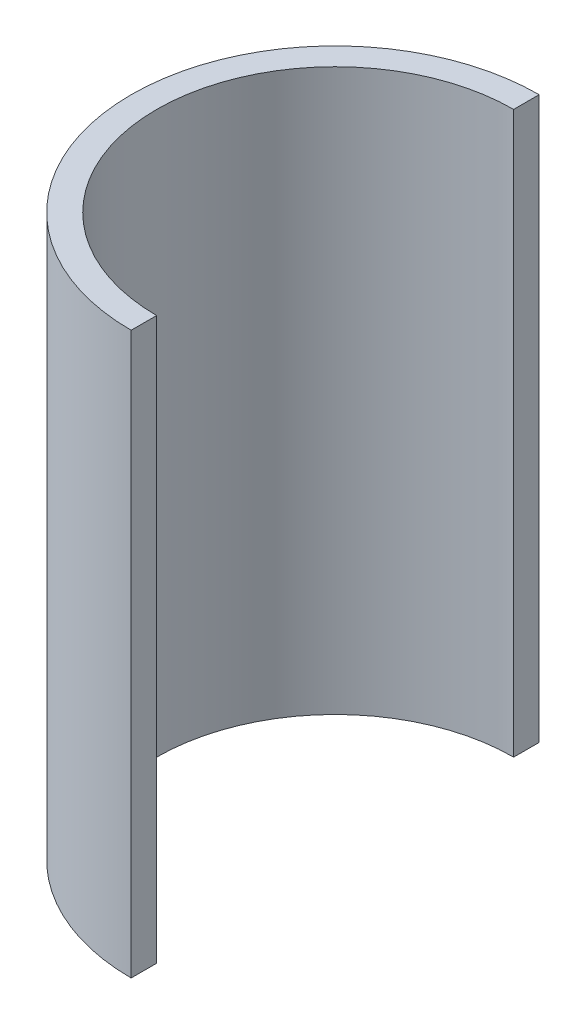
ISO-10303-21;
HEADER;
FILE_DESCRIPTION(('STEP AP214'),'2;1');
FILE_NAME('part.step','',(''),(''),'','','');
FILE_SCHEMA(('AUTOMOTIVE_DESIGN { 1 0 10303 214 1 1 1 1 }'));
ENDSEC;
DATA;
#1=APPLICATION_CONTEXT('core data for automotive mechanical design processes');
#2=APPLICATION_PROTOCOL_DEFINITION('international standard','automotive_design',2000,#1);
#3=PRODUCT_CONTEXT('',#1,'mechanical');
#4=PRODUCT('Part','Part','',(#3));
#5=PRODUCT_RELATED_PRODUCT_CATEGORY('part','',(#4));
#6=PRODUCT_DEFINITION_FORMATION('','',#4);
#7=PRODUCT_DEFINITION_CONTEXT('part definition',#1,'design');
#8=PRODUCT_DEFINITION('design','',#6,#7);
#9=PRODUCT_DEFINITION_SHAPE('','',#8);
#10=(LENGTH_UNIT() NAMED_UNIT(*) SI_UNIT(.MILLI.,.METRE.));
#11=(NAMED_UNIT(*) PLANE_ANGLE_UNIT() SI_UNIT($,.RADIAN.));
#12=(NAMED_UNIT(*) SI_UNIT($,.STERADIAN.) SOLID_ANGLE_UNIT());
#13=UNCERTAINTY_MEASURE_WITH_UNIT(LENGTH_MEASURE(1.E-05),#10,'distance_accuracy_value','');
#14=(GEOMETRIC_REPRESENTATION_CONTEXT(3) GLOBAL_UNCERTAINTY_ASSIGNED_CONTEXT((#13)) GLOBAL_UNIT_ASSIGNED_CONTEXT((#10,
#11,#12)) REPRESENTATION_CONTEXT('',''));
#15=CARTESIAN_POINT('',(0.,0.,0.));
#16=DIRECTION('',(0.,0.,1.));
#17=DIRECTION('',(1.,0.,0.));
#18=AXIS2_PLACEMENT_3D('',#15,#16,#17);
#19=CARTESIAN_POINT('',(0.,110.,0.));
#20=DIRECTION('',(0.,-1.,0.));
#21=DIRECTION('',(0.,0.,-1.));
#22=AXIS2_PLACEMENT_3D('',#19,#20,#21);
#23=CYLINDRICAL_SURFACE('',#22,40.);
#24=CARTESIAN_POINT('',(0.,0.,0.));
#25=DIRECTION('',(0.,1.,0.));
#26=DIRECTION('',(0.,0.,1.));
#27=AXIS2_PLACEMENT_3D('',#24,#25,#26);
#28=CIRCLE('',#27,40.);
#29=CARTESIAN_POINT('',(0.,0.,-40.));
#30=VERTEX_POINT('',#29);
#31=CARTESIAN_POINT('',(0.,0.,40.));
#32=VERTEX_POINT('',#31);
#33=EDGE_CURVE('E95',#30,#32,#28,.T.);
#34=ORIENTED_EDGE('',*,*,#33,.T.);
#35=DIRECTION('',(0.,-1.,0.));
#36=VECTOR('',#35,1.);
#37=CARTESIAN_POINT('',(0.,110.,40.));
#38=LINE('',#37,#36);
#39=CARTESIAN_POINT('',(0.,110.,40.));
#40=VERTEX_POINT('',#39);
#41=EDGE_CURVE('E11',#40,#32,#38,.T.);
#42=ORIENTED_EDGE('',*,*,#41,.F.);
#43=CARTESIAN_POINT('',(0.,110.,0.));
#44=DIRECTION('',(0.,1.,0.));
#45=DIRECTION('',(0.,0.,1.));
#46=AXIS2_PLACEMENT_3D('',#43,#44,#45);
#47=CIRCLE('',#46,40.);
#48=CARTESIAN_POINT('',(0.,110.,-40.));
#49=VERTEX_POINT('',#48);
#50=EDGE_CURVE('E83',#49,#40,#47,.T.);
#51=ORIENTED_EDGE('',*,*,#50,.F.);
#52=DIRECTION('',(0.,-1.,0.));
#53=VECTOR('',#52,1.);
#54=CARTESIAN_POINT('',(0.,110.,-40.));
#55=LINE('',#54,#53);
#56=EDGE_CURVE('E91',#49,#30,#55,.T.);
#57=ORIENTED_EDGE('',*,*,#56,.T.);
#58=EDGE_LOOP('',(#34,#42,#51,#57));
#59=FACE_BOUND('',#58,.T.);
#60=ADVANCED_FACE('F32',(#59),#23,.T.);
#61=CARTESIAN_POINT('',(0.,110.,35.));
#62=DIRECTION('',(-1.,0.,0.));
#63=DIRECTION('',(0.,0.,1.));
#64=AXIS2_PLACEMENT_3D('',#61,#62,#63);
#65=PLANE('',#64);
#66=DIRECTION('',(0.,0.,-1.));
#67=VECTOR('',#66,1.);
#68=CARTESIAN_POINT('',(0.,0.,35.));
#69=LINE('',#68,#67);
#70=CARTESIAN_POINT('',(0.,0.,35.));
#71=VERTEX_POINT('',#70);
#72=EDGE_CURVE('E87',#32,#71,#69,.T.);
#73=ORIENTED_EDGE('',*,*,#72,.T.);
#74=DIRECTION('',(0.,-1.,0.));
#75=VECTOR('',#74,1.);
#76=CARTESIAN_POINT('',(0.,110.,35.));
#77=LINE('',#76,#75);
#78=CARTESIAN_POINT('',(0.,110.,35.));
#79=VERTEX_POINT('',#78);
#80=EDGE_CURVE('E40',#79,#71,#77,.T.);
#81=ORIENTED_EDGE('',*,*,#80,.F.);
#82=DIRECTION('',(0.,0.,-1.));
#83=VECTOR('',#82,1.);
#84=CARTESIAN_POINT('',(0.,110.,35.));
#85=LINE('',#84,#83);
#86=EDGE_CURVE('E78',#40,#79,#85,.T.);
#87=ORIENTED_EDGE('',*,*,#86,.F.);
#88=ORIENTED_EDGE('',*,*,#41,.T.);
#89=EDGE_LOOP('',(#73,#81,#87,#88));
#90=FACE_BOUND('',#89,.T.);
#91=ADVANCED_FACE('F86',(#90),#65,.F.);
#92=CARTESIAN_POINT('',(0.,110.,0.));
#93=DIRECTION('',(0.,-1.,0.));
#94=DIRECTION('',(0.,0.,-1.));
#95=AXIS2_PLACEMENT_3D('',#92,#93,#94);
#96=CYLINDRICAL_SURFACE('',#95,35.);
#97=CARTESIAN_POINT('',(0.,0.,0.));
#98=DIRECTION('',(0.,-1.,0.));
#99=DIRECTION('',(0.,0.,1.));
#100=AXIS2_PLACEMENT_3D('',#97,#98,#99);
#101=CIRCLE('',#100,35.);
#102=CARTESIAN_POINT('',(0.,0.,-35.));
#103=VERTEX_POINT('',#102);
#104=EDGE_CURVE('E65',#71,#103,#101,.T.);
#105=ORIENTED_EDGE('',*,*,#104,.T.);
#106=DIRECTION('',(0.,-1.,0.));
#107=VECTOR('',#106,1.);
#108=CARTESIAN_POINT('',(0.,110.,-35.));
#109=LINE('',#108,#107);
#110=CARTESIAN_POINT('',(0.,110.,-35.));
#111=VERTEX_POINT('',#110);
#112=EDGE_CURVE('E88',#111,#103,#109,.T.);
#113=ORIENTED_EDGE('',*,*,#112,.F.);
#114=CARTESIAN_POINT('',(0.,110.,0.));
#115=DIRECTION('',(0.,-1.,0.));
#116=DIRECTION('',(0.,0.,1.));
#117=AXIS2_PLACEMENT_3D('',#114,#115,#116);
#118=CIRCLE('',#117,35.);
#119=EDGE_CURVE('E81',#79,#111,#118,.T.);
#120=ORIENTED_EDGE('',*,*,#119,.F.);
#121=ORIENTED_EDGE('',*,*,#80,.T.);
#122=EDGE_LOOP('',(#105,#113,#120,#121));
#123=FACE_BOUND('',#122,.T.);
#124=ADVANCED_FACE('F89',(#123),#96,.F.);
#125=CARTESIAN_POINT('',(0.,110.,-40.));
#126=DIRECTION('',(-1.,0.,0.));
#127=DIRECTION('',(0.,0.,1.));
#128=AXIS2_PLACEMENT_3D('',#125,#126,#127);
#129=PLANE('',#128);
#130=DIRECTION('',(0.,0.,-1.));
#131=VECTOR('',#130,1.);
#132=CARTESIAN_POINT('',(0.,0.,-40.));
#133=LINE('',#132,#131);
#134=EDGE_CURVE('E71',#103,#30,#133,.T.);
#135=ORIENTED_EDGE('',*,*,#134,.T.);
#136=ORIENTED_EDGE('',*,*,#56,.F.);
#137=DIRECTION('',(0.,0.,-1.));
#138=VECTOR('',#137,1.);
#139=CARTESIAN_POINT('',(0.,110.,-40.));
#140=LINE('',#139,#138);
#141=EDGE_CURVE('E48',#111,#49,#140,.T.);
#142=ORIENTED_EDGE('',*,*,#141,.F.);
#143=ORIENTED_EDGE('',*,*,#112,.T.);
#144=EDGE_LOOP('',(#135,#136,#142,#143));
#145=FACE_BOUND('',#144,.T.);
#146=ADVANCED_FACE('F102',(#145),#129,.F.);
#147=CARTESIAN_POINT('',(0.,110.,0.));
#148=DIRECTION('',(0.,1.,0.));
#149=DIRECTION('',(0.,0.,1.));
#150=AXIS2_PLACEMENT_3D('',#147,#148,#149);
#151=PLANE('',#150);
#152=ORIENTED_EDGE('',*,*,#50,.T.);
#153=ORIENTED_EDGE('',*,*,#86,.T.);
#154=ORIENTED_EDGE('',*,*,#119,.T.);
#155=ORIENTED_EDGE('',*,*,#141,.T.);
#156=EDGE_LOOP('',(#152,#153,#154,#155));
#157=FACE_BOUND('',#156,.T.);
#158=ADVANCED_FACE('F79',(#157),#151,.T.);
#159=CARTESIAN_POINT('',(0.,0.,0.));
#160=DIRECTION('',(0.,1.,0.));
#161=DIRECTION('',(0.,0.,1.));
#162=AXIS2_PLACEMENT_3D('',#159,#160,#161);
#163=PLANE('',#162);
#164=ORIENTED_EDGE('',*,*,#33,.F.);
#165=ORIENTED_EDGE('',*,*,#134,.F.);
#166=ORIENTED_EDGE('',*,*,#104,.F.);
#167=ORIENTED_EDGE('',*,*,#72,.F.);
#168=EDGE_LOOP('',(#164,#165,#166,#167));
#169=FACE_BOUND('',#168,.T.);
#170=ADVANCED_FACE('F105',(#169),#163,.F.);
#171=CLOSED_SHELL('',(#60,#91,#124,#146,#158,#170));
#172=MANIFOLD_SOLID_BREP('B2',#171);
#173=ADVANCED_BREP_SHAPE_REPRESENTATION('',(#18,#172),#14);
#174=SHAPE_DEFINITION_REPRESENTATION(#9,#173);
ENDSEC;
END-ISO-10303-21;
